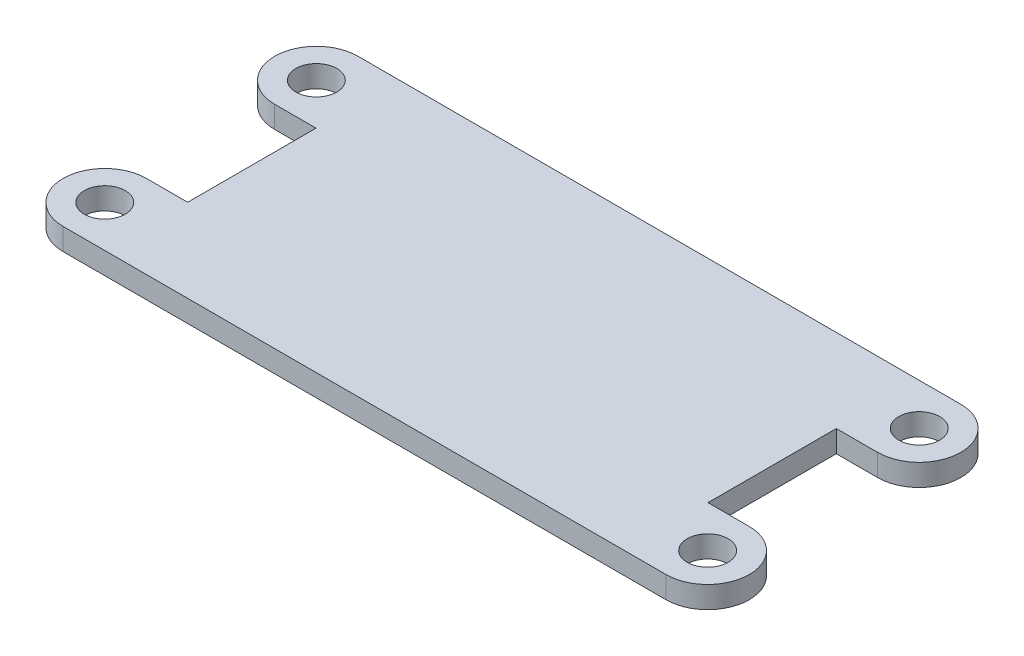
ISO-10303-21;
HEADER;
FILE_DESCRIPTION(('STEP AP214'),'2;1');
FILE_NAME('part.step','',(''),(''),'','','');
FILE_SCHEMA(('AUTOMOTIVE_DESIGN { 1 0 10303 214 1 1 1 1 }'));
ENDSEC;
DATA;
#1=APPLICATION_CONTEXT('core data for automotive mechanical design processes');
#2=APPLICATION_PROTOCOL_DEFINITION('international standard','automotive_design',2000,#1);
#3=PRODUCT_CONTEXT('',#1,'mechanical');
#4=PRODUCT('Part','Part','',(#3));
#5=PRODUCT_RELATED_PRODUCT_CATEGORY('part','',(#4));
#6=PRODUCT_DEFINITION_FORMATION('','',#4);
#7=PRODUCT_DEFINITION_CONTEXT('part definition',#1,'design');
#8=PRODUCT_DEFINITION('design','',#6,#7);
#9=PRODUCT_DEFINITION_SHAPE('','',#8);
#10=(LENGTH_UNIT() NAMED_UNIT(*) SI_UNIT(.MILLI.,.METRE.));
#11=(NAMED_UNIT(*) PLANE_ANGLE_UNIT() SI_UNIT($,.RADIAN.));
#12=(NAMED_UNIT(*) SI_UNIT($,.STERADIAN.) SOLID_ANGLE_UNIT());
#13=UNCERTAINTY_MEASURE_WITH_UNIT(LENGTH_MEASURE(1.E-05),#10,'distance_accuracy_value','');
#14=(GEOMETRIC_REPRESENTATION_CONTEXT(3) GLOBAL_UNCERTAINTY_ASSIGNED_CONTEXT((#13)) GLOBAL_UNIT_ASSIGNED_CONTEXT((#10,
#11,#12)) REPRESENTATION_CONTEXT('',''));
#15=CARTESIAN_POINT('',(0.,0.,0.));
#16=DIRECTION('',(0.,0.,1.));
#17=DIRECTION('',(1.,0.,0.));
#18=AXIS2_PLACEMENT_3D('',#15,#16,#17);
#19=CARTESIAN_POINT('',(0.,0.8,10.795));
#20=DIRECTION('',(0.,0.,-1.));
#21=DIRECTION('',(-1.,0.,0.));
#22=AXIS2_PLACEMENT_3D('',#19,#20,#21);
#23=PLANE('',#22);
#24=DIRECTION('',(1.,0.,0.));
#25=VECTOR('',#24,1.);
#26=CARTESIAN_POINT('',(0.,-0.8,10.795));
#27=LINE('',#26,#25);
#28=CARTESIAN_POINT('',(-22.075,-0.8,10.795));
#29=VERTEX_POINT('',#28);
#30=CARTESIAN_POINT('',(22.075,-0.8,10.795));
#31=VERTEX_POINT('',#30);
#32=EDGE_CURVE('E169',#29,#31,#27,.T.);
#33=ORIENTED_EDGE('',*,*,#32,.T.);
#34=DIRECTION('',(0.,-1.,0.));
#35=VECTOR('',#34,1.);
#36=CARTESIAN_POINT('',(22.075,0.8,10.795));
#37=LINE('',#36,#35);
#38=CARTESIAN_POINT('',(22.075,0.8,10.795));
#39=VERTEX_POINT('',#38);
#40=EDGE_CURVE('E11',#39,#31,#37,.T.);
#41=ORIENTED_EDGE('',*,*,#40,.F.);
#42=DIRECTION('',(1.,0.,0.));
#43=VECTOR('',#42,1.);
#44=CARTESIAN_POINT('',(0.,0.8,10.795));
#45=LINE('',#44,#43);
#46=CARTESIAN_POINT('',(-22.075,0.8,10.795));
#47=VERTEX_POINT('',#46);
#48=EDGE_CURVE('E102',#47,#39,#45,.T.);
#49=ORIENTED_EDGE('',*,*,#48,.F.);
#50=DIRECTION('',(0.,-1.,0.));
#51=VECTOR('',#50,1.);
#52=CARTESIAN_POINT('',(-22.075,0.8,10.795));
#53=LINE('',#52,#51);
#54=EDGE_CURVE('E168',#47,#29,#53,.T.);
#55=ORIENTED_EDGE('',*,*,#54,.T.);
#56=EDGE_LOOP('',(#33,#41,#49,#55));
#57=FACE_BOUND('',#56,.T.);
#58=ADVANCED_FACE('F35',(#57),#23,.F.);
#59=CARTESIAN_POINT('',(22.075,0.8,7.747));
#60=DIRECTION('',(0.,-1.,0.));
#61=DIRECTION('',(0.,0.,-1.));
#62=AXIS2_PLACEMENT_3D('',#59,#60,#61);
#63=CYLINDRICAL_SURFACE('',#62,3.048);
#64=CARTESIAN_POINT('',(22.075,-0.8,7.747));
#65=DIRECTION('',(0.,1.,0.));
#66=DIRECTION('',(0.,0.,1.));
#67=AXIS2_PLACEMENT_3D('',#64,#65,#66);
#68=CIRCLE('',#67,3.048);
#69=CARTESIAN_POINT('',(22.075,-0.8,4.699));
#70=VERTEX_POINT('',#69);
#71=EDGE_CURVE('E172',#70,#31,#68,.F.);
#72=ORIENTED_EDGE('',*,*,#71,.F.);
#73=DIRECTION('',(0.,-1.,0.));
#74=VECTOR('',#73,1.);
#75=CARTESIAN_POINT('',(22.075,0.8,4.699));
#76=LINE('',#75,#74);
#77=CARTESIAN_POINT('',(22.075,0.8,4.699));
#78=VERTEX_POINT('',#77);
#79=EDGE_CURVE('E43',#78,#70,#76,.T.);
#80=ORIENTED_EDGE('',*,*,#79,.F.);
#81=CARTESIAN_POINT('',(22.075,0.8,7.747));
#82=DIRECTION('',(0.,1.,0.));
#83=DIRECTION('',(0.,0.,1.));
#84=AXIS2_PLACEMENT_3D('',#81,#82,#83);
#85=CIRCLE('',#84,3.048);
#86=EDGE_CURVE('E481',#78,#39,#85,.F.);
#87=ORIENTED_EDGE('',*,*,#86,.T.);
#88=ORIENTED_EDGE('',*,*,#40,.T.);
#89=EDGE_LOOP('',(#72,#80,#87,#88));
#90=FACE_BOUND('',#89,.T.);
#91=ADVANCED_FACE('F234',(#90),#63,.T.);
#92=CARTESIAN_POINT('',(0.,0.8,4.69899999999976));
#93=DIRECTION('',(0.,0.,-1.));
#94=DIRECTION('',(-1.,0.,0.));
#95=AXIS2_PLACEMENT_3D('',#92,#93,#94);
#96=PLANE('',#95);
#97=DIRECTION('',(1.,0.,0.));
#98=VECTOR('',#97,1.);
#99=CARTESIAN_POINT('',(0.,-0.8,4.69899999999976));
#100=LINE('',#99,#98);
#101=CARTESIAN_POINT('',(19.05,-0.8,4.69899999999998));
#102=VERTEX_POINT('',#101);
#103=EDGE_CURVE('E175',#102,#70,#100,.T.);
#104=ORIENTED_EDGE('',*,*,#103,.F.);
#105=DIRECTION('',(0.,-1.,0.));
#106=VECTOR('',#105,1.);
#107=CARTESIAN_POINT('',(19.05,0.8,4.69899999999998));
#108=LINE('',#107,#106);
#109=CARTESIAN_POINT('',(19.05,0.8,4.69899999999998));
#110=VERTEX_POINT('',#109);
#111=EDGE_CURVE('E224',#110,#102,#108,.T.);
#112=ORIENTED_EDGE('',*,*,#111,.F.);
#113=DIRECTION('',(1.,0.,0.));
#114=VECTOR('',#113,1.);
#115=CARTESIAN_POINT('',(0.,0.8,4.69899999999976));
#116=LINE('',#115,#114);
#117=EDGE_CURVE('E231',#110,#78,#116,.T.);
#118=ORIENTED_EDGE('',*,*,#117,.T.);
#119=ORIENTED_EDGE('',*,*,#79,.T.);
#120=EDGE_LOOP('',(#104,#112,#118,#119));
#121=FACE_BOUND('',#120,.T.);
#122=ADVANCED_FACE('F229',(#121),#96,.T.);
#123=CARTESIAN_POINT('',(19.05,0.8,0.));
#124=DIRECTION('',(-1.,0.,0.));
#125=DIRECTION('',(0.,0.,1.));
#126=AXIS2_PLACEMENT_3D('',#123,#124,#125);
#127=PLANE('',#126);
#128=DIRECTION('',(0.,0.,-1.));
#129=VECTOR('',#128,1.);
#130=CARTESIAN_POINT('',(19.05,-0.8,0.));
#131=LINE('',#130,#129);
#132=CARTESIAN_POINT('',(19.05,-0.8,-4.69899999999998));
#133=VERTEX_POINT('',#132);
#134=EDGE_CURVE('E178',#102,#133,#131,.T.);
#135=ORIENTED_EDGE('',*,*,#134,.T.);
#136=DIRECTION('',(0.,-1.,0.));
#137=VECTOR('',#136,1.);
#138=CARTESIAN_POINT('',(19.05,0.8,-4.69899999999998));
#139=LINE('',#138,#137);
#140=CARTESIAN_POINT('',(19.05,0.8,-4.69899999999998));
#141=VERTEX_POINT('',#140);
#142=EDGE_CURVE('E221',#141,#133,#139,.T.);
#143=ORIENTED_EDGE('',*,*,#142,.F.);
#144=DIRECTION('',(0.,0.,-1.));
#145=VECTOR('',#144,1.);
#146=CARTESIAN_POINT('',(19.05,0.8,0.));
#147=LINE('',#146,#145);
#148=EDGE_CURVE('E253',#110,#141,#147,.T.);
#149=ORIENTED_EDGE('',*,*,#148,.F.);
#150=ORIENTED_EDGE('',*,*,#111,.T.);
#151=EDGE_LOOP('',(#135,#143,#149,#150));
#152=FACE_BOUND('',#151,.T.);
#153=ADVANCED_FACE('F244',(#152),#127,.F.);
#154=CARTESIAN_POINT('',(0.,0.8,-4.69899999999976));
#155=DIRECTION('',(0.,0.,-1.));
#156=DIRECTION('',(-1.,0.,0.));
#157=AXIS2_PLACEMENT_3D('',#154,#155,#156);
#158=PLANE('',#157);
#159=DIRECTION('',(1.,0.,0.));
#160=VECTOR('',#159,1.);
#161=CARTESIAN_POINT('',(0.,-0.8,-4.69899999999976));
#162=LINE('',#161,#160);
#163=CARTESIAN_POINT('',(22.075,-0.8,-4.699));
#164=VERTEX_POINT('',#163);
#165=EDGE_CURVE('E180',#133,#164,#162,.T.);
#166=ORIENTED_EDGE('',*,*,#165,.T.);
#167=DIRECTION('',(0.,-1.,0.));
#168=VECTOR('',#167,1.);
#169=CARTESIAN_POINT('',(22.075,0.8,-4.699));
#170=LINE('',#169,#168);
#171=CARTESIAN_POINT('',(22.075,0.8,-4.699));
#172=VERTEX_POINT('',#171);
#173=EDGE_CURVE('E218',#172,#164,#170,.T.);
#174=ORIENTED_EDGE('',*,*,#173,.F.);
#175=DIRECTION('',(1.,0.,0.));
#176=VECTOR('',#175,1.);
#177=CARTESIAN_POINT('',(0.,0.8,-4.69899999999976));
#178=LINE('',#177,#176);
#179=EDGE_CURVE('E250',#141,#172,#178,.T.);
#180=ORIENTED_EDGE('',*,*,#179,.F.);
#181=ORIENTED_EDGE('',*,*,#142,.T.);
#182=EDGE_LOOP('',(#166,#174,#180,#181));
#183=FACE_BOUND('',#182,.T.);
#184=ADVANCED_FACE('F248',(#183),#158,.F.);
#185=CARTESIAN_POINT('',(22.075,0.8,-7.747));
#186=DIRECTION('',(0.,-1.,0.));
#187=DIRECTION('',(0.,0.,-1.));
#188=AXIS2_PLACEMENT_3D('',#185,#186,#187);
#189=CYLINDRICAL_SURFACE('',#188,3.048);
#190=CARTESIAN_POINT('',(22.075,-0.8,-7.747));
#191=DIRECTION('',(0.,1.,0.));
#192=DIRECTION('',(0.,0.,1.));
#193=AXIS2_PLACEMENT_3D('',#190,#191,#192);
#194=CIRCLE('',#193,3.048);
#195=CARTESIAN_POINT('',(22.075,-0.8,-10.795));
#196=VERTEX_POINT('',#195);
#197=EDGE_CURVE('E182',#164,#196,#194,.T.);
#198=ORIENTED_EDGE('',*,*,#197,.T.);
#199=DIRECTION('',(0.,-1.,0.));
#200=VECTOR('',#199,1.);
#201=CARTESIAN_POINT('',(22.075,0.8,-10.795));
#202=LINE('',#201,#200);
#203=CARTESIAN_POINT('',(22.075,0.8,-10.795));
#204=VERTEX_POINT('',#203);
#205=EDGE_CURVE('E216',#204,#196,#202,.T.);
#206=ORIENTED_EDGE('',*,*,#205,.F.);
#207=CARTESIAN_POINT('',(22.075,0.8,-7.747));
#208=DIRECTION('',(0.,1.,0.));
#209=DIRECTION('',(0.,0.,1.));
#210=AXIS2_PLACEMENT_3D('',#207,#208,#209);
#211=CIRCLE('',#210,3.048);
#212=EDGE_CURVE('E252',#172,#204,#211,.T.);
#213=ORIENTED_EDGE('',*,*,#212,.F.);
#214=ORIENTED_EDGE('',*,*,#173,.T.);
#215=EDGE_LOOP('',(#198,#206,#213,#214));
#216=FACE_BOUND('',#215,.T.);
#217=ADVANCED_FACE('F299',(#216),#189,.T.);
#218=CARTESIAN_POINT('',(0.,0.8,-10.795));
#219=DIRECTION('',(0.,0.,-1.));
#220=DIRECTION('',(-1.,0.,0.));
#221=AXIS2_PLACEMENT_3D('',#218,#219,#220);
#222=PLANE('',#221);
#223=DIRECTION('',(1.,0.,0.));
#224=VECTOR('',#223,1.);
#225=CARTESIAN_POINT('',(0.,-0.8,-10.795));
#226=LINE('',#225,#224);
#227=CARTESIAN_POINT('',(-22.075,-0.8,-10.795));
#228=VERTEX_POINT('',#227);
#229=EDGE_CURVE('E185',#228,#196,#226,.T.);
#230=ORIENTED_EDGE('',*,*,#229,.F.);
#231=DIRECTION('',(0.,-1.,0.));
#232=VECTOR('',#231,1.);
#233=CARTESIAN_POINT('',(-22.075,0.8,-10.795));
#234=LINE('',#233,#232);
#235=CARTESIAN_POINT('',(-22.075,0.8,-10.795));
#236=VERTEX_POINT('',#235);
#237=EDGE_CURVE('E214',#236,#228,#234,.T.);
#238=ORIENTED_EDGE('',*,*,#237,.F.);
#239=DIRECTION('',(1.,0.,0.));
#240=VECTOR('',#239,1.);
#241=CARTESIAN_POINT('',(0.,0.8,-10.795));
#242=LINE('',#241,#240);
#243=EDGE_CURVE('E255',#236,#204,#242,.T.);
#244=ORIENTED_EDGE('',*,*,#243,.T.);
#245=ORIENTED_EDGE('',*,*,#205,.T.);
#246=EDGE_LOOP('',(#230,#238,#244,#245));
#247=FACE_BOUND('',#246,.T.);
#248=ADVANCED_FACE('F302',(#247),#222,.T.);
#249=CARTESIAN_POINT('',(-22.075,0.8,-7.747));
#250=DIRECTION('',(0.,-1.,0.));
#251=DIRECTION('',(0.,0.,-1.));
#252=AXIS2_PLACEMENT_3D('',#249,#250,#251);
#253=CYLINDRICAL_SURFACE('',#252,3.048);
#254=CARTESIAN_POINT('',(-22.075,-0.8,-7.747));
#255=DIRECTION('',(0.,1.,0.));
#256=DIRECTION('',(0.,0.,1.));
#257=AXIS2_PLACEMENT_3D('',#254,#255,#256);
#258=CIRCLE('',#257,3.048);
#259=CARTESIAN_POINT('',(-22.075,-0.8,-4.699));
#260=VERTEX_POINT('',#259);
#261=EDGE_CURVE('E188',#260,#228,#258,.F.);
#262=ORIENTED_EDGE('',*,*,#261,.F.);
#263=DIRECTION('',(0.,-1.,0.));
#264=VECTOR('',#263,1.);
#265=CARTESIAN_POINT('',(-22.075,0.8,-4.699));
#266=LINE('',#265,#264);
#267=CARTESIAN_POINT('',(-22.075,0.8,-4.699));
#268=VERTEX_POINT('',#267);
#269=EDGE_CURVE('E212',#268,#260,#266,.T.);
#270=ORIENTED_EDGE('',*,*,#269,.F.);
#271=CARTESIAN_POINT('',(-22.075,0.8,-7.747));
#272=DIRECTION('',(0.,1.,0.));
#273=DIRECTION('',(0.,0.,1.));
#274=AXIS2_PLACEMENT_3D('',#271,#272,#273);
#275=CIRCLE('',#274,3.048);
#276=EDGE_CURVE('E151',#268,#236,#275,.F.);
#277=ORIENTED_EDGE('',*,*,#276,.T.);
#278=ORIENTED_EDGE('',*,*,#237,.T.);
#279=EDGE_LOOP('',(#262,#270,#277,#278));
#280=FACE_BOUND('',#279,.T.);
#281=ADVANCED_FACE('F264',(#280),#253,.T.);
#282=CARTESIAN_POINT('',(0.,0.8,-4.69899999999976));
#283=DIRECTION('',(0.,0.,1.));
#284=DIRECTION('',(1.,0.,0.));
#285=AXIS2_PLACEMENT_3D('',#282,#283,#284);
#286=PLANE('',#285);
#287=DIRECTION('',(-1.,0.,0.));
#288=VECTOR('',#287,1.);
#289=CARTESIAN_POINT('',(0.,-0.8,-4.69899999999976));
#290=LINE('',#289,#288);
#291=CARTESIAN_POINT('',(-19.05,-0.8,-4.69899999999998));
#292=VERTEX_POINT('',#291);
#293=EDGE_CURVE('E191',#292,#260,#290,.T.);
#294=ORIENTED_EDGE('',*,*,#293,.F.);
#295=DIRECTION('',(0.,-1.,0.));
#296=VECTOR('',#295,1.);
#297=CARTESIAN_POINT('',(-19.05,0.8,-4.69899999999998));
#298=LINE('',#297,#296);
#299=CARTESIAN_POINT('',(-19.05,0.8,-4.69899999999998));
#300=VERTEX_POINT('',#299);
#301=EDGE_CURVE('E138',#300,#292,#298,.T.);
#302=ORIENTED_EDGE('',*,*,#301,.F.);
#303=DIRECTION('',(-1.,0.,0.));
#304=VECTOR('',#303,1.);
#305=CARTESIAN_POINT('',(0.,0.8,-4.69899999999976));
#306=LINE('',#305,#304);
#307=EDGE_CURVE('E149',#300,#268,#306,.T.);
#308=ORIENTED_EDGE('',*,*,#307,.T.);
#309=ORIENTED_EDGE('',*,*,#269,.T.);
#310=EDGE_LOOP('',(#294,#302,#308,#309));
#311=FACE_BOUND('',#310,.T.);
#312=ADVANCED_FACE('F269',(#311),#286,.T.);
#313=CARTESIAN_POINT('',(-19.05,0.8,0.));
#314=DIRECTION('',(-1.,0.,0.));
#315=DIRECTION('',(0.,0.,1.));
#316=AXIS2_PLACEMENT_3D('',#313,#314,#315);
#317=PLANE('',#316);
#318=DIRECTION('',(0.,0.,-1.));
#319=VECTOR('',#318,1.);
#320=CARTESIAN_POINT('',(-19.05,-0.8,0.));
#321=LINE('',#320,#319);
#322=CARTESIAN_POINT('',(-19.05,-0.8,4.69899999999998));
#323=VERTEX_POINT('',#322);
#324=EDGE_CURVE('E137',#323,#292,#321,.T.);
#325=ORIENTED_EDGE('',*,*,#324,.F.);
#326=DIRECTION('',(0.,-1.,0.));
#327=VECTOR('',#326,1.);
#328=CARTESIAN_POINT('',(-19.05,0.8,4.69899999999998));
#329=LINE('',#328,#327);
#330=CARTESIAN_POINT('',(-19.05,0.8,4.69899999999998));
#331=VERTEX_POINT('',#330);
#332=EDGE_CURVE('E131',#331,#323,#329,.T.);
#333=ORIENTED_EDGE('',*,*,#332,.F.);
#334=DIRECTION('',(0.,0.,-1.));
#335=VECTOR('',#334,1.);
#336=CARTESIAN_POINT('',(-19.05,0.8,0.));
#337=LINE('',#336,#335);
#338=EDGE_CURVE('E135',#331,#300,#337,.T.);
#339=ORIENTED_EDGE('',*,*,#338,.T.);
#340=ORIENTED_EDGE('',*,*,#301,.T.);
#341=EDGE_LOOP('',(#325,#333,#339,#340));
#342=FACE_BOUND('',#341,.T.);
#343=ADVANCED_FACE('F133',(#342),#317,.T.);
#344=CARTESIAN_POINT('',(0.,0.8,4.69899999999976));
#345=DIRECTION('',(0.,0.,1.));
#346=DIRECTION('',(1.,0.,0.));
#347=AXIS2_PLACEMENT_3D('',#344,#345,#346);
#348=PLANE('',#347);
#349=DIRECTION('',(-1.,0.,0.));
#350=VECTOR('',#349,1.);
#351=CARTESIAN_POINT('',(0.,-0.8,4.69899999999976));
#352=LINE('',#351,#350);
#353=CARTESIAN_POINT('',(-22.075,-0.8,4.699));
#354=VERTEX_POINT('',#353);
#355=EDGE_CURVE('E90',#323,#354,#352,.T.);
#356=ORIENTED_EDGE('',*,*,#355,.T.);
#357=DIRECTION('',(0.,-1.,0.));
#358=VECTOR('',#357,1.);
#359=CARTESIAN_POINT('',(-22.075,0.8,4.699));
#360=LINE('',#359,#358);
#361=CARTESIAN_POINT('',(-22.075,0.8,4.699));
#362=VERTEX_POINT('',#361);
#363=EDGE_CURVE('E139',#362,#354,#360,.T.);
#364=ORIENTED_EDGE('',*,*,#363,.F.);
#365=DIRECTION('',(-1.,0.,0.));
#366=VECTOR('',#365,1.);
#367=CARTESIAN_POINT('',(0.,0.8,4.69899999999976));
#368=LINE('',#367,#366);
#369=EDGE_CURVE('E141',#331,#362,#368,.T.);
#370=ORIENTED_EDGE('',*,*,#369,.F.);
#371=ORIENTED_EDGE('',*,*,#332,.T.);
#372=EDGE_LOOP('',(#356,#364,#370,#371));
#373=FACE_BOUND('',#372,.T.);
#374=ADVANCED_FACE('F142',(#373),#348,.F.);
#375=CARTESIAN_POINT('',(22.075,0.8,-7.747));
#376=DIRECTION('',(0.,-1.,0.));
#377=DIRECTION('',(0.,0.,-1.));
#378=AXIS2_PLACEMENT_3D('',#375,#376,#377);
#379=CYLINDRICAL_SURFACE('',#378,1.5);
#380=CARTESIAN_POINT('',(22.075,0.8,-7.747));
#381=DIRECTION('',(0.,1.,0.));
#382=DIRECTION('',(0.,0.,1.));
#383=AXIS2_PLACEMENT_3D('',#380,#381,#382);
#384=CIRCLE('',#383,1.5);
#385=CARTESIAN_POINT('',(22.075,0.8,-6.247));
#386=VERTEX_POINT('',#385);
#387=EDGE_CURVE('E162',#386,#386,#384,.T.);
#388=ORIENTED_EDGE('',*,*,#387,.T.);
#389=EDGE_LOOP('',(#388));
#390=FACE_BOUND('',#389,.T.);
#391=CARTESIAN_POINT('',(22.075,-0.8,-7.747));
#392=DIRECTION('',(0.,1.,0.));
#393=DIRECTION('',(0.,0.,1.));
#394=AXIS2_PLACEMENT_3D('',#391,#392,#393);
#395=CIRCLE('',#394,1.5);
#396=CARTESIAN_POINT('',(22.075,-0.8,-6.247));
#397=VERTEX_POINT('',#396);
#398=EDGE_CURVE('E203',#397,#397,#395,.T.);
#399=ORIENTED_EDGE('',*,*,#398,.F.);
#400=EDGE_LOOP('',(#399));
#401=FACE_BOUND('',#400,.T.);
#402=ADVANCED_FACE('F313',(#390,#401),#379,.F.);
#403=CARTESIAN_POINT('',(-22.075,0.8,-7.747));
#404=DIRECTION('',(0.,-1.,0.));
#405=DIRECTION('',(0.,0.,-1.));
#406=AXIS2_PLACEMENT_3D('',#403,#404,#405);
#407=CYLINDRICAL_SURFACE('',#406,1.5);
#408=CARTESIAN_POINT('',(-22.075,0.8,-7.747));
#409=DIRECTION('',(0.,1.,0.));
#410=DIRECTION('',(0.,0.,1.));
#411=AXIS2_PLACEMENT_3D('',#408,#409,#410);
#412=CIRCLE('',#411,1.5);
#413=CARTESIAN_POINT('',(-22.075,0.8,-6.247));
#414=VERTEX_POINT('',#413);
#415=EDGE_CURVE('E159',#414,#414,#412,.T.);
#416=ORIENTED_EDGE('',*,*,#415,.T.);
#417=EDGE_LOOP('',(#416));
#418=FACE_BOUND('',#417,.T.);
#419=CARTESIAN_POINT('',(-22.075,-0.8,-7.747));
#420=DIRECTION('',(0.,1.,0.));
#421=DIRECTION('',(0.,0.,1.));
#422=AXIS2_PLACEMENT_3D('',#419,#420,#421);
#423=CIRCLE('',#422,1.5);
#424=CARTESIAN_POINT('',(-22.075,-0.8,-6.247));
#425=VERTEX_POINT('',#424);
#426=EDGE_CURVE('E200',#425,#425,#423,.T.);
#427=ORIENTED_EDGE('',*,*,#426,.F.);
#428=EDGE_LOOP('',(#427));
#429=FACE_BOUND('',#428,.T.);
#430=ADVANCED_FACE('F282',(#418,#429),#407,.F.);
#431=CARTESIAN_POINT('',(-22.075,0.8,7.747));
#432=DIRECTION('',(0.,-1.,0.));
#433=DIRECTION('',(0.,0.,-1.));
#434=AXIS2_PLACEMENT_3D('',#431,#432,#433);
#435=CYLINDRICAL_SURFACE('',#434,1.5);
#436=CARTESIAN_POINT('',(-22.075,0.8,7.747));
#437=DIRECTION('',(0.,1.,0.));
#438=DIRECTION('',(0.,0.,1.));
#439=AXIS2_PLACEMENT_3D('',#436,#437,#438);
#440=CIRCLE('',#439,1.5);
#441=CARTESIAN_POINT('',(-22.075,0.8,9.247));
#442=VERTEX_POINT('',#441);
#443=EDGE_CURVE('E156',#442,#442,#440,.T.);
#444=ORIENTED_EDGE('',*,*,#443,.T.);
#445=EDGE_LOOP('',(#444));
#446=FACE_BOUND('',#445,.T.);
#447=CARTESIAN_POINT('',(-22.075,-0.8,7.747));
#448=DIRECTION('',(0.,1.,0.));
#449=DIRECTION('',(0.,0.,1.));
#450=AXIS2_PLACEMENT_3D('',#447,#448,#449);
#451=CIRCLE('',#450,1.5);
#452=CARTESIAN_POINT('',(-22.075,-0.8,9.247));
#453=VERTEX_POINT('',#452);
#454=EDGE_CURVE('E197',#453,#453,#451,.T.);
#455=ORIENTED_EDGE('',*,*,#454,.F.);
#456=EDGE_LOOP('',(#455));
#457=FACE_BOUND('',#456,.T.);
#458=ADVANCED_FACE('F274',(#446,#457),#435,.F.);
#459=CARTESIAN_POINT('',(-22.075,0.8,7.747));
#460=DIRECTION('',(0.,-1.,0.));
#461=DIRECTION('',(0.,0.,-1.));
#462=AXIS2_PLACEMENT_3D('',#459,#460,#461);
#463=CYLINDRICAL_SURFACE('',#462,3.048);
#464=CARTESIAN_POINT('',(-22.075,-0.8,7.747));
#465=DIRECTION('',(0.,1.,0.));
#466=DIRECTION('',(0.,0.,1.));
#467=AXIS2_PLACEMENT_3D('',#464,#465,#466);
#468=CIRCLE('',#467,3.048);
#469=EDGE_CURVE('E96',#354,#29,#468,.T.);
#470=ORIENTED_EDGE('',*,*,#469,.T.);
#471=ORIENTED_EDGE('',*,*,#54,.F.);
#472=CARTESIAN_POINT('',(-22.075,0.8,7.747));
#473=DIRECTION('',(0.,1.,0.));
#474=DIRECTION('',(0.,0.,1.));
#475=AXIS2_PLACEMENT_3D('',#472,#473,#474);
#476=CIRCLE('',#475,3.048);
#477=EDGE_CURVE('E51',#362,#47,#476,.T.);
#478=ORIENTED_EDGE('',*,*,#477,.F.);
#479=ORIENTED_EDGE('',*,*,#363,.T.);
#480=EDGE_LOOP('',(#470,#471,#478,#479));
#481=FACE_BOUND('',#480,.T.);
#482=ADVANCED_FACE('F271',(#481),#463,.T.);
#483=CARTESIAN_POINT('',(22.075,0.8,7.747));
#484=DIRECTION('',(0.,-1.,0.));
#485=DIRECTION('',(0.,0.,-1.));
#486=AXIS2_PLACEMENT_3D('',#483,#484,#485);
#487=CYLINDRICAL_SURFACE('',#486,1.5);
#488=CARTESIAN_POINT('',(22.075,0.8,7.747));
#489=DIRECTION('',(0.,1.,0.));
#490=DIRECTION('',(0.,0.,1.));
#491=AXIS2_PLACEMENT_3D('',#488,#489,#490);
#492=CIRCLE('',#491,1.5);
#493=CARTESIAN_POINT('',(22.075,0.8,9.247));
#494=VERTEX_POINT('',#493);
#495=EDGE_CURVE('E165',#494,#494,#492,.T.);
#496=ORIENTED_EDGE('',*,*,#495,.T.);
#497=EDGE_LOOP('',(#496));
#498=FACE_BOUND('',#497,.T.);
#499=CARTESIAN_POINT('',(22.075,-0.8,7.747));
#500=DIRECTION('',(0.,1.,0.));
#501=DIRECTION('',(0.,0.,1.));
#502=AXIS2_PLACEMENT_3D('',#499,#500,#501);
#503=CIRCLE('',#502,1.5);
#504=CARTESIAN_POINT('',(22.075,-0.8,9.247));
#505=VERTEX_POINT('',#504);
#506=EDGE_CURVE('E206',#505,#505,#503,.T.);
#507=ORIENTED_EDGE('',*,*,#506,.F.);
#508=EDGE_LOOP('',(#507));
#509=FACE_BOUND('',#508,.T.);
#510=ADVANCED_FACE('F273',(#498,#509),#487,.F.);
#511=CARTESIAN_POINT('',(0.,0.8,0.));
#512=DIRECTION('',(0.,1.,0.));
#513=DIRECTION('',(0.,0.,1.));
#514=AXIS2_PLACEMENT_3D('',#511,#512,#513);
#515=PLANE('',#514);
#516=ORIENTED_EDGE('',*,*,#48,.T.);
#517=ORIENTED_EDGE('',*,*,#86,.F.);
#518=ORIENTED_EDGE('',*,*,#117,.F.);
#519=ORIENTED_EDGE('',*,*,#148,.T.);
#520=ORIENTED_EDGE('',*,*,#179,.T.);
#521=ORIENTED_EDGE('',*,*,#212,.T.);
#522=ORIENTED_EDGE('',*,*,#243,.F.);
#523=ORIENTED_EDGE('',*,*,#276,.F.);
#524=ORIENTED_EDGE('',*,*,#307,.F.);
#525=ORIENTED_EDGE('',*,*,#338,.F.);
#526=ORIENTED_EDGE('',*,*,#369,.T.);
#527=ORIENTED_EDGE('',*,*,#477,.T.);
#528=EDGE_LOOP('',(#516,#517,#518,#519,#520,#521,#522,#523,#524,#525,#526,#527));
#529=FACE_BOUND('',#528,.T.);
#530=ORIENTED_EDGE('',*,*,#443,.F.);
#531=EDGE_LOOP('',(#530));
#532=FACE_BOUND('',#531,.T.);
#533=ORIENTED_EDGE('',*,*,#415,.F.);
#534=EDGE_LOOP('',(#533));
#535=FACE_BOUND('',#534,.T.);
#536=ORIENTED_EDGE('',*,*,#387,.F.);
#537=EDGE_LOOP('',(#536));
#538=FACE_BOUND('',#537,.T.);
#539=ORIENTED_EDGE('',*,*,#495,.F.);
#540=EDGE_LOOP('',(#539));
#541=FACE_BOUND('',#540,.T.);
#542=ADVANCED_FACE('F145',(#529,#532,#535,#538,#541),#515,.T.);
#543=CARTESIAN_POINT('',(0.,-0.8,0.));
#544=DIRECTION('',(0.,1.,0.));
#545=DIRECTION('',(0.,0.,1.));
#546=AXIS2_PLACEMENT_3D('',#543,#544,#545);
#547=PLANE('',#546);
#548=ORIENTED_EDGE('',*,*,#32,.F.);
#549=ORIENTED_EDGE('',*,*,#469,.F.);
#550=ORIENTED_EDGE('',*,*,#355,.F.);
#551=ORIENTED_EDGE('',*,*,#324,.T.);
#552=ORIENTED_EDGE('',*,*,#293,.T.);
#553=ORIENTED_EDGE('',*,*,#261,.T.);
#554=ORIENTED_EDGE('',*,*,#229,.T.);
#555=ORIENTED_EDGE('',*,*,#197,.F.);
#556=ORIENTED_EDGE('',*,*,#165,.F.);
#557=ORIENTED_EDGE('',*,*,#134,.F.);
#558=ORIENTED_EDGE('',*,*,#103,.T.);
#559=ORIENTED_EDGE('',*,*,#71,.T.);
#560=EDGE_LOOP('',(#548,#549,#550,#551,#552,#553,#554,#555,#556,#557,#558,#559));
#561=FACE_BOUND('',#560,.T.);
#562=ORIENTED_EDGE('',*,*,#454,.T.);
#563=EDGE_LOOP('',(#562));
#564=FACE_BOUND('',#563,.T.);
#565=ORIENTED_EDGE('',*,*,#426,.T.);
#566=EDGE_LOOP('',(#565));
#567=FACE_BOUND('',#566,.T.);
#568=ORIENTED_EDGE('',*,*,#398,.T.);
#569=EDGE_LOOP('',(#568));
#570=FACE_BOUND('',#569,.T.);
#571=ORIENTED_EDGE('',*,*,#506,.T.);
#572=EDGE_LOOP('',(#571));
#573=FACE_BOUND('',#572,.T.);
#574=ADVANCED_FACE('F238',(#561,#564,#567,#570,#573),#547,.F.);
#575=CLOSED_SHELL('',(#58,#91,#122,#153,#184,#217,#248,#281,#312,#343,#374,#402,#430,#458,#482,
#510,#542,#574));
#576=MANIFOLD_SOLID_BREP('B2',#575);
#577=ADVANCED_BREP_SHAPE_REPRESENTATION('',(#18,#576),#14);
#578=SHAPE_DEFINITION_REPRESENTATION(#9,#577);
ENDSEC;
END-ISO-10303-21;
